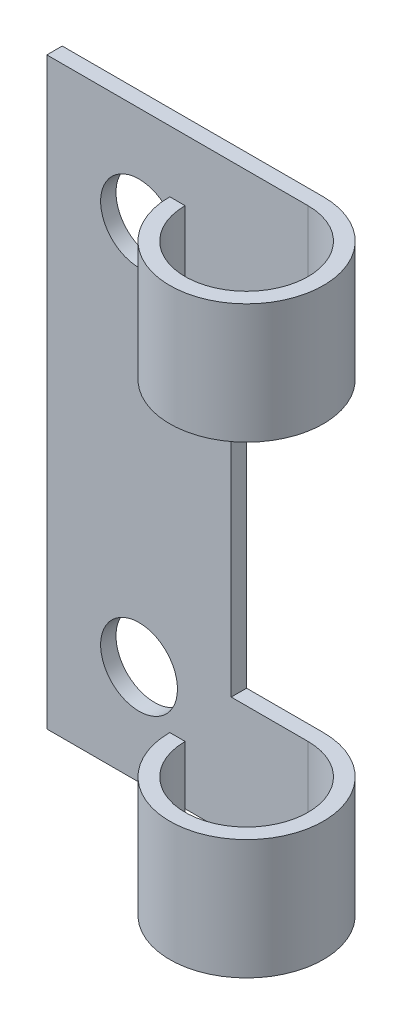
ISO-10303-21;
HEADER;
FILE_DESCRIPTION(('STEP AP214'),'2;1');
FILE_NAME('part.step','',(''),(''),'','','');
FILE_SCHEMA(('AUTOMOTIVE_DESIGN { 1 0 10303 214 1 1 1 1 }'));
ENDSEC;
DATA;
#1=APPLICATION_CONTEXT('core data for automotive mechanical design processes');
#2=APPLICATION_PROTOCOL_DEFINITION('international standard','automotive_design',2000,#1);
#3=PRODUCT_CONTEXT('',#1,'mechanical');
#4=PRODUCT('Part','Part','',(#3));
#5=PRODUCT_RELATED_PRODUCT_CATEGORY('part','',(#4));
#6=PRODUCT_DEFINITION_FORMATION('','',#4);
#7=PRODUCT_DEFINITION_CONTEXT('part definition',#1,'design');
#8=PRODUCT_DEFINITION('design','',#6,#7);
#9=PRODUCT_DEFINITION_SHAPE('','',#8);
#10=(LENGTH_UNIT() NAMED_UNIT(*) SI_UNIT(.MILLI.,.METRE.));
#11=(NAMED_UNIT(*) PLANE_ANGLE_UNIT() SI_UNIT($,.RADIAN.));
#12=(NAMED_UNIT(*) SI_UNIT($,.STERADIAN.) SOLID_ANGLE_UNIT());
#13=UNCERTAINTY_MEASURE_WITH_UNIT(LENGTH_MEASURE(1.E-05),#10,'distance_accuracy_value','');
#14=(GEOMETRIC_REPRESENTATION_CONTEXT(3) GLOBAL_UNCERTAINTY_ASSIGNED_CONTEXT((#13)) GLOBAL_UNIT_ASSIGNED_CONTEXT((#10,
#11,#12)) REPRESENTATION_CONTEXT('',''));
#15=CARTESIAN_POINT('',(0.,0.,0.));
#16=DIRECTION('',(0.,0.,1.));
#17=DIRECTION('',(1.,0.,0.));
#18=AXIS2_PLACEMENT_3D('',#15,#16,#17);
#19=CARTESIAN_POINT('',(0.,0.,1.));
#20=DIRECTION('',(0.,0.,-1.));
#21=DIRECTION('',(-1.,0.,0.));
#22=AXIS2_PLACEMENT_3D('',#19,#20,#21);
#23=PLANE('',#22);
#24=DIRECTION('',(0.,-1.,0.));
#25=VECTOR('',#24,1.);
#26=CARTESIAN_POINT('',(0.,0.,1.));
#27=LINE('',#26,#25);
#28=CARTESIAN_POINT('',(0.,38.,1.));
#29=VERTEX_POINT('',#28);
#30=CARTESIAN_POINT('',(0.,0.,1.));
#31=VERTEX_POINT('',#30);
#32=EDGE_CURVE('E214',#29,#31,#27,.T.);
#33=ORIENTED_EDGE('',*,*,#32,.T.);
#34=DIRECTION('',(1.,0.,0.));
#35=VECTOR('',#34,1.);
#36=CARTESIAN_POINT('',(0.,0.,1.));
#37=LINE('',#36,#35);
#38=CARTESIAN_POINT('',(17.,0.,1.));
#39=VERTEX_POINT('',#38);
#40=EDGE_CURVE('E134',#31,#39,#37,.T.);
#41=ORIENTED_EDGE('',*,*,#40,.T.);
#42=DIRECTION('',(0.,-1.,0.));
#43=VECTOR('',#42,1.);
#44=CARTESIAN_POINT('',(17.,7.8,1.));
#45=LINE('',#44,#43);
#46=CARTESIAN_POINT('',(17.,7.8,1.));
#47=VERTEX_POINT('',#46);
#48=EDGE_CURVE('E131',#47,#39,#45,.T.);
#49=ORIENTED_EDGE('',*,*,#48,.F.);
#50=DIRECTION('',(1.,0.,0.));
#51=VECTOR('',#50,1.);
#52=CARTESIAN_POINT('',(0.,7.8,1.));
#53=LINE('',#52,#51);
#54=CARTESIAN_POINT('',(12.,7.8,1.));
#55=VERTEX_POINT('',#54);
#56=EDGE_CURVE('E122',#55,#47,#53,.T.);
#57=ORIENTED_EDGE('',*,*,#56,.F.);
#58=DIRECTION('',(0.,1.,0.));
#59=VECTOR('',#58,1.);
#60=CARTESIAN_POINT('',(12.,0.,1.));
#61=LINE('',#60,#59);
#62=CARTESIAN_POINT('',(12.,30.2,1.));
#63=VERTEX_POINT('',#62);
#64=EDGE_CURVE('E50',#55,#63,#61,.T.);
#65=ORIENTED_EDGE('',*,*,#64,.T.);
#66=DIRECTION('',(1.,0.,0.));
#67=VECTOR('',#66,1.);
#68=CARTESIAN_POINT('',(12.,30.2,1.));
#69=LINE('',#68,#67);
#70=CARTESIAN_POINT('',(17.,30.2,1.));
#71=VERTEX_POINT('',#70);
#72=EDGE_CURVE('E175',#63,#71,#69,.T.);
#73=ORIENTED_EDGE('',*,*,#72,.T.);
#74=DIRECTION('',(0.,1.,0.));
#75=VECTOR('',#74,1.);
#76=CARTESIAN_POINT('',(17.,30.2,1.));
#77=LINE('',#76,#75);
#78=CARTESIAN_POINT('',(17.,38.,1.));
#79=VERTEX_POINT('',#78);
#80=EDGE_CURVE('E197',#71,#79,#77,.T.);
#81=ORIENTED_EDGE('',*,*,#80,.T.);
#82=DIRECTION('',(-1.,0.,0.));
#83=VECTOR('',#82,1.);
#84=CARTESIAN_POINT('',(0.,38.,1.));
#85=LINE('',#84,#83);
#86=EDGE_CURVE('E219',#79,#29,#85,.T.);
#87=ORIENTED_EDGE('',*,*,#86,.T.);
#88=EDGE_LOOP('',(#33,#41,#49,#57,#65,#73,#81,#87));
#89=FACE_BOUND('',#88,.T.);
#90=CARTESIAN_POINT('',(6.,31.5,1.));
#91=DIRECTION('',(0.,0.,1.));
#92=DIRECTION('',(1.,0.,0.));
#93=AXIS2_PLACEMENT_3D('',#90,#91,#92);
#94=CIRCLE('',#93,2.5);
#95=CARTESIAN_POINT('',(8.5,31.5,1.));
#96=VERTEX_POINT('',#95);
#97=EDGE_CURVE('E208',#96,#96,#94,.T.);
#98=ORIENTED_EDGE('',*,*,#97,.F.);
#99=EDGE_LOOP('',(#98));
#100=FACE_BOUND('',#99,.T.);
#101=CARTESIAN_POINT('',(6.,6.5,1.));
#102=DIRECTION('',(0.,0.,1.));
#103=DIRECTION('',(1.,0.,0.));
#104=AXIS2_PLACEMENT_3D('',#101,#102,#103);
#105=CIRCLE('',#104,2.5);
#106=CARTESIAN_POINT('',(8.5,6.5,1.));
#107=VERTEX_POINT('',#106);
#108=EDGE_CURVE('E202',#107,#107,#105,.T.);
#109=ORIENTED_EDGE('',*,*,#108,.F.);
#110=EDGE_LOOP('',(#109));
#111=FACE_BOUND('',#110,.T.);
#112=ADVANCED_FACE('F35',(#89,#100,#111),#23,.F.);
#113=CARTESIAN_POINT('',(0.,0.,0.));
#114=DIRECTION('',(0.,0.,-1.));
#115=DIRECTION('',(-1.,0.,0.));
#116=AXIS2_PLACEMENT_3D('',#113,#114,#115);
#117=PLANE('',#116);
#118=CARTESIAN_POINT('',(6.,31.5,0.));
#119=DIRECTION('',(0.,0.,1.));
#120=DIRECTION('',(1.,0.,0.));
#121=AXIS2_PLACEMENT_3D('',#118,#119,#120);
#122=CIRCLE('',#121,2.5);
#123=CARTESIAN_POINT('',(8.5,31.5,0.));
#124=VERTEX_POINT('',#123);
#125=EDGE_CURVE('E205',#124,#124,#122,.T.);
#126=ORIENTED_EDGE('',*,*,#125,.T.);
#127=EDGE_LOOP('',(#126));
#128=FACE_BOUND('',#127,.T.);
#129=DIRECTION('',(0.,-1.,0.));
#130=VECTOR('',#129,1.);
#131=CARTESIAN_POINT('',(0.,0.,0.));
#132=LINE('',#131,#130);
#133=CARTESIAN_POINT('',(0.,38.,0.));
#134=VERTEX_POINT('',#133);
#135=CARTESIAN_POINT('',(0.,0.,0.));
#136=VERTEX_POINT('',#135);
#137=EDGE_CURVE('E211',#134,#136,#132,.T.);
#138=ORIENTED_EDGE('',*,*,#137,.F.);
#139=DIRECTION('',(-1.,0.,0.));
#140=VECTOR('',#139,1.);
#141=CARTESIAN_POINT('',(0.,38.,0.));
#142=LINE('',#141,#140);
#143=CARTESIAN_POINT('',(17.,38.,0.));
#144=VERTEX_POINT('',#143);
#145=EDGE_CURVE('E216',#144,#134,#142,.T.);
#146=ORIENTED_EDGE('',*,*,#145,.F.);
#147=DIRECTION('',(0.,1.,0.));
#148=VECTOR('',#147,1.);
#149=CARTESIAN_POINT('',(17.,30.2,0.));
#150=LINE('',#149,#148);
#151=CARTESIAN_POINT('',(17.,30.2,0.));
#152=VERTEX_POINT('',#151);
#153=EDGE_CURVE('E184',#152,#144,#150,.T.);
#154=ORIENTED_EDGE('',*,*,#153,.F.);
#155=DIRECTION('',(-1.,0.,0.));
#156=VECTOR('',#155,1.);
#157=CARTESIAN_POINT('',(12.,30.2,0.));
#158=LINE('',#157,#156);
#159=CARTESIAN_POINT('',(12.,30.2,0.));
#160=VERTEX_POINT('',#159);
#161=EDGE_CURVE('E169',#152,#160,#158,.T.);
#162=ORIENTED_EDGE('',*,*,#161,.T.);
#163=DIRECTION('',(0.,1.,0.));
#164=VECTOR('',#163,1.);
#165=CARTESIAN_POINT('',(12.,0.,0.));
#166=LINE('',#165,#164);
#167=CARTESIAN_POINT('',(12.,7.8,0.));
#168=VERTEX_POINT('',#167);
#169=EDGE_CURVE('E225',#168,#160,#166,.T.);
#170=ORIENTED_EDGE('',*,*,#169,.F.);
#171=DIRECTION('',(-1.,0.,0.));
#172=VECTOR('',#171,1.);
#173=CARTESIAN_POINT('',(0.,7.8,0.));
#174=LINE('',#173,#172);
#175=CARTESIAN_POINT('',(17.,7.8,0.));
#176=VERTEX_POINT('',#175);
#177=EDGE_CURVE('E150',#176,#168,#174,.T.);
#178=ORIENTED_EDGE('',*,*,#177,.F.);
#179=DIRECTION('',(0.,-1.,0.));
#180=VECTOR('',#179,1.);
#181=CARTESIAN_POINT('',(17.,7.8,0.));
#182=LINE('',#181,#180);
#183=CARTESIAN_POINT('',(17.,0.,0.));
#184=VERTEX_POINT('',#183);
#185=EDGE_CURVE('E138',#176,#184,#182,.T.);
#186=ORIENTED_EDGE('',*,*,#185,.T.);
#187=DIRECTION('',(1.,0.,0.));
#188=VECTOR('',#187,1.);
#189=CARTESIAN_POINT('',(0.,0.,0.));
#190=LINE('',#189,#188);
#191=EDGE_CURVE('E223',#136,#184,#190,.T.);
#192=ORIENTED_EDGE('',*,*,#191,.F.);
#193=EDGE_LOOP('',(#138,#146,#154,#162,#170,#178,#186,#192));
#194=FACE_BOUND('',#193,.T.);
#195=CARTESIAN_POINT('',(6.,6.5,0.));
#196=DIRECTION('',(0.,0.,1.));
#197=DIRECTION('',(1.,0.,0.));
#198=AXIS2_PLACEMENT_3D('',#195,#196,#197);
#199=CIRCLE('',#198,2.5);
#200=CARTESIAN_POINT('',(8.5,6.5,0.));
#201=VERTEX_POINT('',#200);
#202=EDGE_CURVE('E194',#201,#201,#199,.T.);
#203=ORIENTED_EDGE('',*,*,#202,.T.);
#204=EDGE_LOOP('',(#203));
#205=FACE_BOUND('',#204,.T.);
#206=ADVANCED_FACE('F235',(#128,#194,#205),#117,.T.);
#207=CARTESIAN_POINT('',(0.,0.,1.));
#208=DIRECTION('',(1.,0.,0.));
#209=DIRECTION('',(0.,0.,-1.));
#210=AXIS2_PLACEMENT_3D('',#207,#208,#209);
#211=PLANE('',#210);
#212=ORIENTED_EDGE('',*,*,#137,.T.);
#213=DIRECTION('',(0.,0.,-1.));
#214=VECTOR('',#213,1.);
#215=CARTESIAN_POINT('',(0.,0.,1.));
#216=LINE('',#215,#214);
#217=EDGE_CURVE('E11',#31,#136,#216,.T.);
#218=ORIENTED_EDGE('',*,*,#217,.F.);
#219=ORIENTED_EDGE('',*,*,#32,.F.);
#220=DIRECTION('',(0.,0.,-1.));
#221=VECTOR('',#220,1.);
#222=CARTESIAN_POINT('',(0.,38.,1.));
#223=LINE('',#222,#221);
#224=EDGE_CURVE('E43',#29,#134,#223,.T.);
#225=ORIENTED_EDGE('',*,*,#224,.T.);
#226=EDGE_LOOP('',(#212,#218,#219,#225));
#227=FACE_BOUND('',#226,.T.);
#228=ADVANCED_FACE('F37',(#227),#211,.F.);
#229=CARTESIAN_POINT('',(0.,0.,1.));
#230=DIRECTION('',(0.,1.,0.));
#231=DIRECTION('',(0.,0.,1.));
#232=AXIS2_PLACEMENT_3D('',#229,#230,#231);
#233=PLANE('',#232);
#234=ORIENTED_EDGE('',*,*,#191,.T.);
#235=CARTESIAN_POINT('',(17.,0.,5.));
#236=DIRECTION('',(0.,1.,0.));
#237=DIRECTION('',(0.,0.,1.));
#238=AXIS2_PLACEMENT_3D('',#235,#236,#237);
#239=CIRCLE('',#238,5.);
#240=CARTESIAN_POINT('',(12.,0.,5.));
#241=VERTEX_POINT('',#240);
#242=EDGE_CURVE('E146',#241,#184,#239,.T.);
#243=ORIENTED_EDGE('',*,*,#242,.F.);
#244=DIRECTION('',(-1.,0.,0.));
#245=VECTOR('',#244,1.);
#246=CARTESIAN_POINT('',(0.,0.,5.));
#247=LINE('',#246,#245);
#248=CARTESIAN_POINT('',(13.,0.,5.));
#249=VERTEX_POINT('',#248);
#250=EDGE_CURVE('E144',#249,#241,#247,.T.);
#251=ORIENTED_EDGE('',*,*,#250,.F.);
#252=CARTESIAN_POINT('',(17.,0.,5.));
#253=DIRECTION('',(0.,1.,0.));
#254=DIRECTION('',(0.,0.,1.));
#255=AXIS2_PLACEMENT_3D('',#252,#253,#254);
#256=CIRCLE('',#255,4.);
#257=EDGE_CURVE('E155',#249,#39,#256,.T.);
#258=ORIENTED_EDGE('',*,*,#257,.T.);
#259=ORIENTED_EDGE('',*,*,#40,.F.);
#260=ORIENTED_EDGE('',*,*,#217,.T.);
#261=EDGE_LOOP('',(#234,#243,#251,#258,#259,#260));
#262=FACE_BOUND('',#261,.T.);
#263=ADVANCED_FACE('F241',(#262),#233,.F.);
#264=CARTESIAN_POINT('',(12.,0.,1.));
#265=DIRECTION('',(-1.,0.,0.));
#266=DIRECTION('',(0.,0.,1.));
#267=AXIS2_PLACEMENT_3D('',#264,#265,#266);
#268=PLANE('',#267);
#269=ORIENTED_EDGE('',*,*,#64,.F.);
#270=DIRECTION('',(0.,0.,1.));
#271=VECTOR('',#270,1.);
#272=CARTESIAN_POINT('',(12.,7.8,1.));
#273=LINE('',#272,#271);
#274=EDGE_CURVE('E54',#168,#55,#273,.T.);
#275=ORIENTED_EDGE('',*,*,#274,.F.);
#276=ORIENTED_EDGE('',*,*,#169,.T.);
#277=DIRECTION('',(0.,0.,1.));
#278=VECTOR('',#277,1.);
#279=CARTESIAN_POINT('',(12.,30.2,0.));
#280=LINE('',#279,#278);
#281=EDGE_CURVE('E173',#160,#63,#280,.T.);
#282=ORIENTED_EDGE('',*,*,#281,.T.);
#283=EDGE_LOOP('',(#269,#275,#276,#282));
#284=FACE_BOUND('',#283,.T.);
#285=ADVANCED_FACE('F260',(#284),#268,.F.);
#286=CARTESIAN_POINT('',(0.,38.,1.));
#287=DIRECTION('',(0.,-1.,0.));
#288=DIRECTION('',(0.,0.,-1.));
#289=AXIS2_PLACEMENT_3D('',#286,#287,#288);
#290=PLANE('',#289);
#291=ORIENTED_EDGE('',*,*,#145,.T.);
#292=ORIENTED_EDGE('',*,*,#224,.F.);
#293=ORIENTED_EDGE('',*,*,#86,.F.);
#294=CARTESIAN_POINT('',(17.,38.,5.));
#295=DIRECTION('',(0.,-1.,0.));
#296=DIRECTION('',(0.,0.,-1.));
#297=AXIS2_PLACEMENT_3D('',#294,#295,#296);
#298=CIRCLE('',#297,4.);
#299=CARTESIAN_POINT('',(13.,38.,5.));
#300=VERTEX_POINT('',#299);
#301=EDGE_CURVE('E187',#79,#300,#298,.T.);
#302=ORIENTED_EDGE('',*,*,#301,.T.);
#303=DIRECTION('',(-1.,0.,0.));
#304=VECTOR('',#303,1.);
#305=CARTESIAN_POINT('',(12.,38.,5.));
#306=LINE('',#305,#304);
#307=CARTESIAN_POINT('',(12.,38.,5.));
#308=VERTEX_POINT('',#307);
#309=EDGE_CURVE('E170',#300,#308,#306,.T.);
#310=ORIENTED_EDGE('',*,*,#309,.T.);
#311=CARTESIAN_POINT('',(17.,38.,5.));
#312=DIRECTION('',(0.,1.,0.));
#313=DIRECTION('',(0.,0.,-1.));
#314=AXIS2_PLACEMENT_3D('',#311,#312,#313);
#315=CIRCLE('',#314,5.);
#316=EDGE_CURVE('E160',#308,#144,#315,.T.);
#317=ORIENTED_EDGE('',*,*,#316,.T.);
#318=EDGE_LOOP('',(#291,#292,#293,#302,#310,#317));
#319=FACE_BOUND('',#318,.T.);
#320=ADVANCED_FACE('F244',(#319),#290,.F.);
#321=CARTESIAN_POINT('',(6.,31.5,1.));
#322=DIRECTION('',(0.,0.,-1.));
#323=DIRECTION('',(-1.,0.,0.));
#324=AXIS2_PLACEMENT_3D('',#321,#322,#323);
#325=CYLINDRICAL_SURFACE('',#324,2.5);
#326=ORIENTED_EDGE('',*,*,#97,.T.);
#327=EDGE_LOOP('',(#326));
#328=FACE_BOUND('',#327,.T.);
#329=ORIENTED_EDGE('',*,*,#125,.F.);
#330=EDGE_LOOP('',(#329));
#331=FACE_BOUND('',#330,.T.);
#332=ADVANCED_FACE('F284',(#328,#331),#325,.F.);
#333=CARTESIAN_POINT('',(6.,6.5,1.));
#334=DIRECTION('',(0.,0.,-1.));
#335=DIRECTION('',(-1.,0.,0.));
#336=AXIS2_PLACEMENT_3D('',#333,#334,#335);
#337=CYLINDRICAL_SURFACE('',#336,2.5);
#338=ORIENTED_EDGE('',*,*,#108,.T.);
#339=EDGE_LOOP('',(#338));
#340=FACE_BOUND('',#339,.T.);
#341=ORIENTED_EDGE('',*,*,#202,.F.);
#342=EDGE_LOOP('',(#341));
#343=FACE_BOUND('',#342,.T.);
#344=ADVANCED_FACE('F366',(#340,#343),#337,.F.);
#345=CARTESIAN_POINT('',(17.,30.2,5.));
#346=DIRECTION('',(0.,1.,0.));
#347=DIRECTION('',(0.,0.,1.));
#348=AXIS2_PLACEMENT_3D('',#345,#346,#347);
#349=CYLINDRICAL_SURFACE('',#348,5.);
#350=ORIENTED_EDGE('',*,*,#316,.F.);
#351=DIRECTION('',(0.,1.,0.));
#352=VECTOR('',#351,1.);
#353=CARTESIAN_POINT('',(12.,30.2,5.));
#354=LINE('',#353,#352);
#355=CARTESIAN_POINT('',(12.,30.2,5.));
#356=VERTEX_POINT('',#355);
#357=EDGE_CURVE('E192',#356,#308,#354,.T.);
#358=ORIENTED_EDGE('',*,*,#357,.F.);
#359=CARTESIAN_POINT('',(17.,30.2,5.));
#360=DIRECTION('',(0.,1.,0.));
#361=DIRECTION('',(0.,0.,-1.));
#362=AXIS2_PLACEMENT_3D('',#359,#360,#361);
#363=CIRCLE('',#362,5.);
#364=EDGE_CURVE('E166',#356,#152,#363,.T.);
#365=ORIENTED_EDGE('',*,*,#364,.T.);
#366=ORIENTED_EDGE('',*,*,#153,.T.);
#367=EDGE_LOOP('',(#350,#358,#365,#366));
#368=FACE_BOUND('',#367,.T.);
#369=ADVANCED_FACE('F253',(#368),#349,.T.);
#370=CARTESIAN_POINT('',(12.,30.2,5.));
#371=DIRECTION('',(0.,0.,-1.));
#372=DIRECTION('',(-1.,0.,0.));
#373=AXIS2_PLACEMENT_3D('',#370,#371,#372);
#374=PLANE('',#373);
#375=ORIENTED_EDGE('',*,*,#309,.F.);
#376=DIRECTION('',(0.,1.,0.));
#377=VECTOR('',#376,1.);
#378=CARTESIAN_POINT('',(13.,30.2,5.));
#379=LINE('',#378,#377);
#380=CARTESIAN_POINT('',(13.,30.2,5.));
#381=VERTEX_POINT('',#380);
#382=EDGE_CURVE('E195',#381,#300,#379,.T.);
#383=ORIENTED_EDGE('',*,*,#382,.F.);
#384=DIRECTION('',(-1.,0.,0.));
#385=VECTOR('',#384,1.);
#386=CARTESIAN_POINT('',(12.,30.2,5.));
#387=LINE('',#386,#385);
#388=EDGE_CURVE('E181',#381,#356,#387,.T.);
#389=ORIENTED_EDGE('',*,*,#388,.T.);
#390=ORIENTED_EDGE('',*,*,#357,.T.);
#391=EDGE_LOOP('',(#375,#383,#389,#390));
#392=FACE_BOUND('',#391,.T.);
#393=ADVANCED_FACE('F248',(#392),#374,.T.);
#394=CARTESIAN_POINT('',(17.,30.2,5.));
#395=DIRECTION('',(0.,1.,0.));
#396=DIRECTION('',(0.,0.,1.));
#397=AXIS2_PLACEMENT_3D('',#394,#395,#396);
#398=CYLINDRICAL_SURFACE('',#397,4.);
#399=ORIENTED_EDGE('',*,*,#301,.F.);
#400=ORIENTED_EDGE('',*,*,#80,.F.);
#401=CARTESIAN_POINT('',(17.,30.2,5.));
#402=DIRECTION('',(0.,-1.,0.));
#403=DIRECTION('',(0.,0.,-1.));
#404=AXIS2_PLACEMENT_3D('',#401,#402,#403);
#405=CIRCLE('',#404,4.);
#406=EDGE_CURVE('E178',#71,#381,#405,.T.);
#407=ORIENTED_EDGE('',*,*,#406,.T.);
#408=ORIENTED_EDGE('',*,*,#382,.T.);
#409=EDGE_LOOP('',(#399,#400,#407,#408));
#410=FACE_BOUND('',#409,.T.);
#411=ADVANCED_FACE('F347',(#410),#398,.F.);
#412=CARTESIAN_POINT('',(17.,30.2,5.));
#413=DIRECTION('',(0.,-1.,0.));
#414=DIRECTION('',(0.,0.,-1.));
#415=AXIS2_PLACEMENT_3D('',#412,#413,#414);
#416=PLANE('',#415);
#417=ORIENTED_EDGE('',*,*,#364,.F.);
#418=ORIENTED_EDGE('',*,*,#388,.F.);
#419=ORIENTED_EDGE('',*,*,#406,.F.);
#420=ORIENTED_EDGE('',*,*,#72,.F.);
#421=ORIENTED_EDGE('',*,*,#281,.F.);
#422=ORIENTED_EDGE('',*,*,#161,.F.);
#423=EDGE_LOOP('',(#417,#418,#419,#420,#421,#422));
#424=FACE_BOUND('',#423,.T.);
#425=ADVANCED_FACE('F257',(#424),#416,.T.);
#426=CARTESIAN_POINT('',(17.,7.8,5.));
#427=DIRECTION('',(0.,-1.,0.));
#428=DIRECTION('',(0.,0.,-1.));
#429=AXIS2_PLACEMENT_3D('',#426,#427,#428);
#430=CYLINDRICAL_SURFACE('',#429,4.);
#431=ORIENTED_EDGE('',*,*,#257,.F.);
#432=DIRECTION('',(0.,-1.,0.));
#433=VECTOR('',#432,1.);
#434=CARTESIAN_POINT('',(13.,7.8,5.));
#435=LINE('',#434,#433);
#436=CARTESIAN_POINT('',(13.,7.8,5.));
#437=VERTEX_POINT('',#436);
#438=EDGE_CURVE('E142',#437,#249,#435,.T.);
#439=ORIENTED_EDGE('',*,*,#438,.F.);
#440=CARTESIAN_POINT('',(17.,7.8,5.));
#441=DIRECTION('',(0.,1.,0.));
#442=DIRECTION('',(0.,0.,1.));
#443=AXIS2_PLACEMENT_3D('',#440,#441,#442);
#444=CIRCLE('',#443,4.);
#445=EDGE_CURVE('E126',#437,#47,#444,.T.);
#446=ORIENTED_EDGE('',*,*,#445,.T.);
#447=ORIENTED_EDGE('',*,*,#48,.T.);
#448=EDGE_LOOP('',(#431,#439,#446,#447));
#449=FACE_BOUND('',#448,.T.);
#450=ADVANCED_FACE('F141',(#449),#430,.F.);
#451=CARTESIAN_POINT('',(0.,7.8,5.));
#452=DIRECTION('',(0.,0.,1.));
#453=DIRECTION('',(1.,0.,0.));
#454=AXIS2_PLACEMENT_3D('',#451,#452,#453);
#455=PLANE('',#454);
#456=ORIENTED_EDGE('',*,*,#250,.T.);
#457=DIRECTION('',(0.,-1.,0.));
#458=VECTOR('',#457,1.);
#459=CARTESIAN_POINT('',(12.,7.8,5.));
#460=LINE('',#459,#458);
#461=CARTESIAN_POINT('',(12.,7.8,5.));
#462=VERTEX_POINT('',#461);
#463=EDGE_CURVE('E161',#462,#241,#460,.T.);
#464=ORIENTED_EDGE('',*,*,#463,.F.);
#465=DIRECTION('',(-1.,0.,0.));
#466=VECTOR('',#465,1.);
#467=CARTESIAN_POINT('',(0.,7.8,5.));
#468=LINE('',#467,#466);
#469=EDGE_CURVE('E139',#437,#462,#468,.T.);
#470=ORIENTED_EDGE('',*,*,#469,.F.);
#471=ORIENTED_EDGE('',*,*,#438,.T.);
#472=EDGE_LOOP('',(#456,#464,#470,#471));
#473=FACE_BOUND('',#472,.T.);
#474=ADVANCED_FACE('F266',(#473),#455,.F.);
#475=CARTESIAN_POINT('',(17.,7.8,5.));
#476=DIRECTION('',(0.,-1.,0.));
#477=DIRECTION('',(0.,0.,-1.));
#478=AXIS2_PLACEMENT_3D('',#475,#476,#477);
#479=CYLINDRICAL_SURFACE('',#478,5.);
#480=ORIENTED_EDGE('',*,*,#242,.T.);
#481=ORIENTED_EDGE('',*,*,#185,.F.);
#482=CARTESIAN_POINT('',(17.,7.8,5.));
#483=DIRECTION('',(0.,1.,0.));
#484=DIRECTION('',(0.,0.,1.));
#485=AXIS2_PLACEMENT_3D('',#482,#483,#484);
#486=CIRCLE('',#485,5.);
#487=EDGE_CURVE('E152',#462,#176,#486,.T.);
#488=ORIENTED_EDGE('',*,*,#487,.F.);
#489=ORIENTED_EDGE('',*,*,#463,.T.);
#490=EDGE_LOOP('',(#480,#481,#488,#489));
#491=FACE_BOUND('',#490,.T.);
#492=ADVANCED_FACE('F264',(#491),#479,.T.);
#493=CARTESIAN_POINT('',(17.,7.8,5.));
#494=DIRECTION('',(0.,1.,0.));
#495=DIRECTION('',(0.,0.,1.));
#496=AXIS2_PLACEMENT_3D('',#493,#494,#495);
#497=PLANE('',#496);
#498=ORIENTED_EDGE('',*,*,#445,.F.);
#499=ORIENTED_EDGE('',*,*,#469,.T.);
#500=ORIENTED_EDGE('',*,*,#487,.T.);
#501=ORIENTED_EDGE('',*,*,#177,.T.);
#502=ORIENTED_EDGE('',*,*,#274,.T.);
#503=ORIENTED_EDGE('',*,*,#56,.T.);
#504=EDGE_LOOP('',(#498,#499,#500,#501,#502,#503));
#505=FACE_BOUND('',#504,.T.);
#506=ADVANCED_FACE('F124',(#505),#497,.T.);
#507=CLOSED_SHELL('',(#112,#206,#228,#263,#285,#320,#332,#344,#369,#393,#411,#425,#450,#474,
#492,#506));
#508=MANIFOLD_SOLID_BREP('B2',#507);
#509=ADVANCED_BREP_SHAPE_REPRESENTATION('',(#18,#508),#14);
#510=SHAPE_DEFINITION_REPRESENTATION(#9,#509);
ENDSEC;
END-ISO-10303-21;
